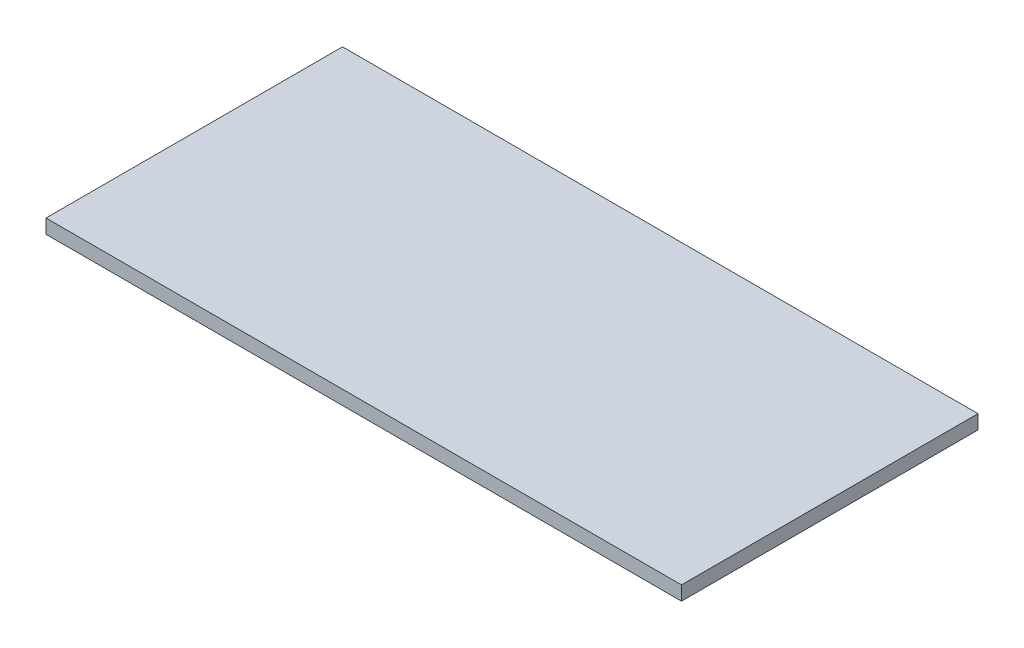
ISO-10303-21;
HEADER;
FILE_DESCRIPTION(('STEP AP214'),'2;1');
FILE_NAME('part.step','',(''),(''),'','','');
FILE_SCHEMA(('AUTOMOTIVE_DESIGN { 1 0 10303 214 1 1 1 1 }'));
ENDSEC;
DATA;
#1=APPLICATION_CONTEXT('core data for automotive mechanical design processes');
#2=APPLICATION_PROTOCOL_DEFINITION('international standard','automotive_design',2000,#1);
#3=PRODUCT_CONTEXT('',#1,'mechanical');
#4=PRODUCT('Part','Part','',(#3));
#5=PRODUCT_RELATED_PRODUCT_CATEGORY('part','',(#4));
#6=PRODUCT_DEFINITION_FORMATION('','',#4);
#7=PRODUCT_DEFINITION_CONTEXT('part definition',#1,'design');
#8=PRODUCT_DEFINITION('design','',#6,#7);
#9=PRODUCT_DEFINITION_SHAPE('','',#8);
#10=(LENGTH_UNIT() NAMED_UNIT(*) SI_UNIT(.MILLI.,.METRE.));
#11=(NAMED_UNIT(*) PLANE_ANGLE_UNIT() SI_UNIT($,.RADIAN.));
#12=(NAMED_UNIT(*) SI_UNIT($,.STERADIAN.) SOLID_ANGLE_UNIT());
#13=UNCERTAINTY_MEASURE_WITH_UNIT(LENGTH_MEASURE(1.E-05),#10,'distance_accuracy_value','');
#14=(GEOMETRIC_REPRESENTATION_CONTEXT(3) GLOBAL_UNCERTAINTY_ASSIGNED_CONTEXT((#13)) GLOBAL_UNIT_ASSIGNED_CONTEXT((#10,
#11,#12)) REPRESENTATION_CONTEXT('',''));
#15=CARTESIAN_POINT('',(0.,0.,0.));
#16=DIRECTION('',(0.,0.,1.));
#17=DIRECTION('',(1.,0.,0.));
#18=AXIS2_PLACEMENT_3D('',#15,#16,#17);
#19=CARTESIAN_POINT('',(-47.1814661134163,2.,-24.0645796623657));
#20=DIRECTION('',(1.,0.,0.));
#21=DIRECTION('',(0.,0.,-1.));
#22=AXIS2_PLACEMENT_3D('',#19,#20,#21);
#23=PLANE('',#22);
#24=DIRECTION('',(0.,0.,1.));
#25=VECTOR('',#24,1.);
#26=CARTESIAN_POINT('',(-47.1814661134163,0.,-24.0645796623657));
#27=LINE('',#26,#25);
#28=CARTESIAN_POINT('',(-47.1814661134163,0.,-24.0645796623657));
#29=VERTEX_POINT('',#28);
#30=CARTESIAN_POINT('',(-47.1814661134163,0.,17.9354203376343));
#31=VERTEX_POINT('',#30);
#32=EDGE_CURVE('E98',#29,#31,#27,.T.);
#33=ORIENTED_EDGE('',*,*,#32,.T.);
#34=DIRECTION('',(0.,-1.,0.));
#35=VECTOR('',#34,1.);
#36=CARTESIAN_POINT('',(-47.1814661134163,2.,17.9354203376343));
#37=LINE('',#36,#35);
#38=CARTESIAN_POINT('',(-47.1814661134163,2.,17.9354203376343));
#39=VERTEX_POINT('',#38);
#40=EDGE_CURVE('E11',#39,#31,#37,.T.);
#41=ORIENTED_EDGE('',*,*,#40,.F.);
#42=DIRECTION('',(0.,0.,1.));
#43=VECTOR('',#42,1.);
#44=CARTESIAN_POINT('',(-47.1814661134163,2.,-24.0645796623657));
#45=LINE('',#44,#43);
#46=CARTESIAN_POINT('',(-47.1814661134163,2.,-24.0645796623657));
#47=VERTEX_POINT('',#46);
#48=EDGE_CURVE('E86',#47,#39,#45,.T.);
#49=ORIENTED_EDGE('',*,*,#48,.F.);
#50=DIRECTION('',(0.,-1.,0.));
#51=VECTOR('',#50,1.);
#52=CARTESIAN_POINT('',(-47.1814661134163,2.,-24.0645796623657));
#53=LINE('',#52,#51);
#54=EDGE_CURVE('E94',#47,#29,#53,.T.);
#55=ORIENTED_EDGE('',*,*,#54,.T.);
#56=EDGE_LOOP('',(#33,#41,#49,#55));
#57=FACE_BOUND('',#56,.T.);
#58=ADVANCED_FACE('F35',(#57),#23,.F.);
#59=CARTESIAN_POINT('',(-47.1814661134163,2.,17.9354203376343));
#60=DIRECTION('',(0.,0.,-1.));
#61=DIRECTION('',(-1.,0.,0.));
#62=AXIS2_PLACEMENT_3D('',#59,#60,#61);
#63=PLANE('',#62);
#64=DIRECTION('',(1.,0.,0.));
#65=VECTOR('',#64,1.);
#66=CARTESIAN_POINT('',(-47.1814661134163,0.,17.9354203376343));
#67=LINE('',#66,#65);
#68=CARTESIAN_POINT('',(42.8185338865837,0.,17.9354203376343));
#69=VERTEX_POINT('',#68);
#70=EDGE_CURVE('E90',#31,#69,#67,.T.);
#71=ORIENTED_EDGE('',*,*,#70,.T.);
#72=DIRECTION('',(0.,-1.,0.));
#73=VECTOR('',#72,1.);
#74=CARTESIAN_POINT('',(42.8185338865837,2.,17.9354203376343));
#75=LINE('',#74,#73);
#76=CARTESIAN_POINT('',(42.8185338865837,2.,17.9354203376343));
#77=VERTEX_POINT('',#76);
#78=EDGE_CURVE('E43',#77,#69,#75,.T.);
#79=ORIENTED_EDGE('',*,*,#78,.F.);
#80=DIRECTION('',(1.,0.,0.));
#81=VECTOR('',#80,1.);
#82=CARTESIAN_POINT('',(-47.1814661134163,2.,17.9354203376343));
#83=LINE('',#82,#81);
#84=EDGE_CURVE('E81',#39,#77,#83,.T.);
#85=ORIENTED_EDGE('',*,*,#84,.F.);
#86=ORIENTED_EDGE('',*,*,#40,.T.);
#87=EDGE_LOOP('',(#71,#79,#85,#86));
#88=FACE_BOUND('',#87,.T.);
#89=ADVANCED_FACE('F89',(#88),#63,.F.);
#90=CARTESIAN_POINT('',(42.8185338865837,2.,-24.0645796623657));
#91=DIRECTION('',(-1.,0.,0.));
#92=DIRECTION('',(0.,0.,1.));
#93=AXIS2_PLACEMENT_3D('',#90,#91,#92);
#94=PLANE('',#93);
#95=DIRECTION('',(0.,0.,-1.));
#96=VECTOR('',#95,1.);
#97=CARTESIAN_POINT('',(42.8185338865837,0.,-24.0645796623657));
#98=LINE('',#97,#96);
#99=CARTESIAN_POINT('',(42.8185338865837,0.,-24.0645796623657));
#100=VERTEX_POINT('',#99);
#101=EDGE_CURVE('E68',#69,#100,#98,.T.);
#102=ORIENTED_EDGE('',*,*,#101,.T.);
#103=DIRECTION('',(0.,-1.,0.));
#104=VECTOR('',#103,1.);
#105=CARTESIAN_POINT('',(42.8185338865837,2.,-24.0645796623657));
#106=LINE('',#105,#104);
#107=CARTESIAN_POINT('',(42.8185338865837,2.,-24.0645796623657));
#108=VERTEX_POINT('',#107);
#109=EDGE_CURVE('E91',#108,#100,#106,.T.);
#110=ORIENTED_EDGE('',*,*,#109,.F.);
#111=DIRECTION('',(0.,0.,-1.));
#112=VECTOR('',#111,1.);
#113=CARTESIAN_POINT('',(42.8185338865837,2.,-24.0645796623657));
#114=LINE('',#113,#112);
#115=EDGE_CURVE('E84',#77,#108,#114,.T.);
#116=ORIENTED_EDGE('',*,*,#115,.F.);
#117=ORIENTED_EDGE('',*,*,#78,.T.);
#118=EDGE_LOOP('',(#102,#110,#116,#117));
#119=FACE_BOUND('',#118,.T.);
#120=ADVANCED_FACE('F92',(#119),#94,.F.);
#121=CARTESIAN_POINT('',(-47.1814661134163,2.,-24.0645796623657));
#122=DIRECTION('',(0.,0.,1.));
#123=DIRECTION('',(1.,0.,0.));
#124=AXIS2_PLACEMENT_3D('',#121,#122,#123);
#125=PLANE('',#124);
#126=DIRECTION('',(-1.,0.,0.));
#127=VECTOR('',#126,1.);
#128=CARTESIAN_POINT('',(-47.1814661134163,0.,-24.0645796623657));
#129=LINE('',#128,#127);
#130=EDGE_CURVE('E74',#100,#29,#129,.T.);
#131=ORIENTED_EDGE('',*,*,#130,.T.);
#132=ORIENTED_EDGE('',*,*,#54,.F.);
#133=DIRECTION('',(-1.,0.,0.));
#134=VECTOR('',#133,1.);
#135=CARTESIAN_POINT('',(-47.1814661134163,2.,-24.0645796623657));
#136=LINE('',#135,#134);
#137=EDGE_CURVE('E51',#108,#47,#136,.T.);
#138=ORIENTED_EDGE('',*,*,#137,.F.);
#139=ORIENTED_EDGE('',*,*,#109,.T.);
#140=EDGE_LOOP('',(#131,#132,#138,#139));
#141=FACE_BOUND('',#140,.T.);
#142=ADVANCED_FACE('F105',(#141),#125,.F.);
#143=CARTESIAN_POINT('',(0.,2.,0.));
#144=DIRECTION('',(0.,1.,0.));
#145=DIRECTION('',(0.,0.,1.));
#146=AXIS2_PLACEMENT_3D('',#143,#144,#145);
#147=PLANE('',#146);
#148=ORIENTED_EDGE('',*,*,#48,.T.);
#149=ORIENTED_EDGE('',*,*,#84,.T.);
#150=ORIENTED_EDGE('',*,*,#115,.T.);
#151=ORIENTED_EDGE('',*,*,#137,.T.);
#152=EDGE_LOOP('',(#148,#149,#150,#151));
#153=FACE_BOUND('',#152,.T.);
#154=ADVANCED_FACE('F82',(#153),#147,.T.);
#155=CARTESIAN_POINT('',(0.,0.,0.));
#156=DIRECTION('',(0.,1.,0.));
#157=DIRECTION('',(0.,0.,1.));
#158=AXIS2_PLACEMENT_3D('',#155,#156,#157);
#159=PLANE('',#158);
#160=ORIENTED_EDGE('',*,*,#32,.F.);
#161=ORIENTED_EDGE('',*,*,#130,.F.);
#162=ORIENTED_EDGE('',*,*,#101,.F.);
#163=ORIENTED_EDGE('',*,*,#70,.F.);
#164=EDGE_LOOP('',(#160,#161,#162,#163));
#165=FACE_BOUND('',#164,.T.);
#166=ADVANCED_FACE('F108',(#165),#159,.F.);
#167=CLOSED_SHELL('',(#58,#89,#120,#142,#154,#166));
#168=MANIFOLD_SOLID_BREP('B2',#167);
#169=ADVANCED_BREP_SHAPE_REPRESENTATION('',(#18,#168),#14);
#170=SHAPE_DEFINITION_REPRESENTATION(#9,#169);
ENDSEC;
END-ISO-10303-21;
